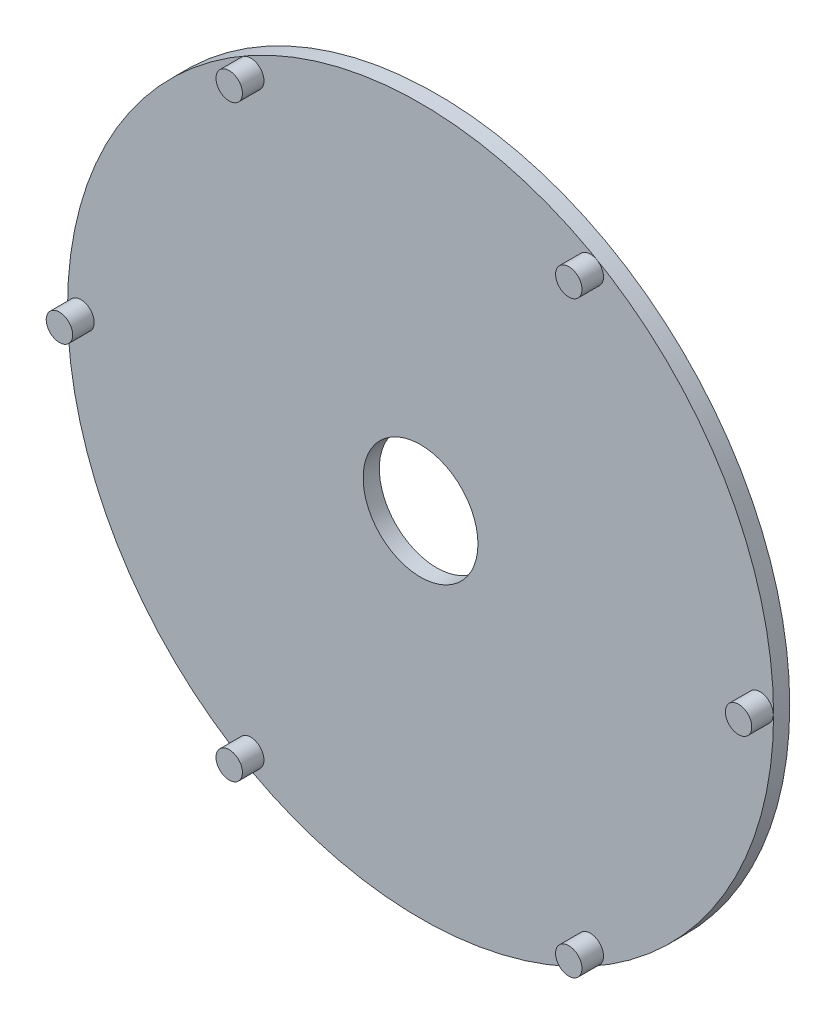
ISO-10303-21;
HEADER;
FILE_DESCRIPTION(('STEP AP214'),'2;1');
FILE_NAME('part.step','',(''),(''),'','','');
FILE_SCHEMA(('AUTOMOTIVE_DESIGN { 1 0 10303 214 1 1 1 1 }'));
ENDSEC;
DATA;
#1=APPLICATION_CONTEXT('core data for automotive mechanical design processes');
#2=APPLICATION_PROTOCOL_DEFINITION('international standard','automotive_design',2000,#1);
#3=PRODUCT_CONTEXT('',#1,'mechanical');
#4=PRODUCT('Part','Part','',(#3));
#5=PRODUCT_RELATED_PRODUCT_CATEGORY('part','',(#4));
#6=PRODUCT_DEFINITION_FORMATION('','',#4);
#7=PRODUCT_DEFINITION_CONTEXT('part definition',#1,'design');
#8=PRODUCT_DEFINITION('design','',#6,#7);
#9=PRODUCT_DEFINITION_SHAPE('','',#8);
#10=(LENGTH_UNIT() NAMED_UNIT(*) SI_UNIT(.MILLI.,.METRE.));
#11=(NAMED_UNIT(*) PLANE_ANGLE_UNIT() SI_UNIT($,.RADIAN.));
#12=(NAMED_UNIT(*) SI_UNIT($,.STERADIAN.) SOLID_ANGLE_UNIT());
#13=UNCERTAINTY_MEASURE_WITH_UNIT(LENGTH_MEASURE(1.E-05),#10,'distance_accuracy_value','');
#14=(GEOMETRIC_REPRESENTATION_CONTEXT(3) GLOBAL_UNCERTAINTY_ASSIGNED_CONTEXT((#13)) GLOBAL_UNIT_ASSIGNED_CONTEXT((#10,
#11,#12)) REPRESENTATION_CONTEXT('',''));
#15=CARTESIAN_POINT('',(0.,0.,0.));
#16=DIRECTION('',(0.,0.,1.));
#17=DIRECTION('',(1.,0.,0.));
#18=AXIS2_PLACEMENT_3D('',#15,#16,#17);
#19=CARTESIAN_POINT('',(0.,0.,-3.));
#20=DIRECTION('',(0.,0.,1.));
#21=DIRECTION('',(1.,0.,0.));
#22=AXIS2_PLACEMENT_3D('',#19,#20,#21);
#23=CYLINDRICAL_SURFACE('',#22,65.5);
#24=CARTESIAN_POINT('',(0.,0.,-3.));
#25=DIRECTION('',(0.,0.,1.));
#26=DIRECTION('',(1.,0.,0.));
#27=AXIS2_PLACEMENT_3D('',#24,#25,#26);
#28=CIRCLE('',#27,65.5);
#29=CARTESIAN_POINT('',(65.5,0.,-3.));
#30=VERTEX_POINT('',#29);
#31=EDGE_CURVE('E10',#30,#30,#28,.T.);
#32=ORIENTED_EDGE('',*,*,#31,.T.);
#33=EDGE_LOOP('',(#32));
#34=FACE_BOUND('',#33,.T.);
#35=CARTESIAN_POINT('',(0.,0.,0.));
#36=DIRECTION('',(0.,0.,1.));
#37=DIRECTION('',(1.,0.,0.));
#38=AXIS2_PLACEMENT_3D('',#35,#36,#37);
#39=CIRCLE('',#38,65.5);
#40=CARTESIAN_POINT('',(65.5,0.,0.));
#41=VERTEX_POINT('',#40);
#42=EDGE_CURVE('E44',#41,#41,#39,.T.);
#43=ORIENTED_EDGE('',*,*,#42,.F.);
#44=EDGE_LOOP('',(#43));
#45=FACE_BOUND('',#44,.T.);
#46=ADVANCED_FACE('F41',(#34,#45),#23,.T.);
#47=CARTESIAN_POINT('',(0.,0.,-3.));
#48=DIRECTION('',(0.,0.,1.));
#49=DIRECTION('',(1.,0.,0.));
#50=AXIS2_PLACEMENT_3D('',#47,#48,#49);
#51=PLANE('',#50);
#52=CARTESIAN_POINT('',(0.,0.,-3.));
#53=DIRECTION('',(0.,0.,1.));
#54=DIRECTION('',(1.,0.,0.));
#55=AXIS2_PLACEMENT_3D('',#52,#53,#54);
#56=CIRCLE('',#55,10.65);
#57=CARTESIAN_POINT('',(10.65,0.,-3.));
#58=VERTEX_POINT('',#57);
#59=EDGE_CURVE('E86',#58,#58,#56,.T.);
#60=ORIENTED_EDGE('',*,*,#59,.T.);
#61=EDGE_LOOP('',(#60));
#62=FACE_BOUND('',#61,.T.);
#63=ORIENTED_EDGE('',*,*,#31,.F.);
#64=EDGE_LOOP('',(#63));
#65=FACE_BOUND('',#64,.T.);
#66=ADVANCED_FACE('F95',(#62,#65),#51,.F.);
#67=CARTESIAN_POINT('',(0.,0.,0.));
#68=DIRECTION('',(0.,0.,1.));
#69=DIRECTION('',(1.,0.,0.));
#70=AXIS2_PLACEMENT_3D('',#67,#68,#69);
#71=PLANE('',#70);
#72=CARTESIAN_POINT('',(0.,0.,0.));
#73=DIRECTION('',(0.,0.,1.));
#74=DIRECTION('',(1.,0.,0.));
#75=AXIS2_PLACEMENT_3D('',#72,#73,#74);
#76=CIRCLE('',#75,10.65);
#77=CARTESIAN_POINT('',(10.65,0.,0.));
#78=VERTEX_POINT('',#77);
#79=EDGE_CURVE('E89',#78,#78,#76,.T.);
#80=ORIENTED_EDGE('',*,*,#79,.F.);
#81=EDGE_LOOP('',(#80));
#82=FACE_BOUND('',#81,.T.);
#83=CARTESIAN_POINT('',(-31.5,-54.5596004384197,0.));
#84=DIRECTION('',(0.,0.,1.));
#85=DIRECTION('',(1.,0.,0.));
#86=AXIS2_PLACEMENT_3D('',#83,#84,#85);
#87=CIRCLE('',#86,2.45);
#88=CARTESIAN_POINT('',(-29.05,-54.5596004384197,0.));
#89=VERTEX_POINT('',#88);
#90=EDGE_CURVE('E80',#89,#89,#87,.T.);
#91=ORIENTED_EDGE('',*,*,#90,.F.);
#92=EDGE_LOOP('',(#91));
#93=FACE_BOUND('',#92,.T.);
#94=CARTESIAN_POINT('',(31.5,-54.5596004384196,0.));
#95=DIRECTION('',(0.,0.,1.));
#96=DIRECTION('',(1.,0.,0.));
#97=AXIS2_PLACEMENT_3D('',#94,#95,#96);
#98=CIRCLE('',#97,2.45);
#99=CARTESIAN_POINT('',(33.95,-54.5596004384196,0.));
#100=VERTEX_POINT('',#99);
#101=EDGE_CURVE('E74',#100,#100,#98,.T.);
#102=ORIENTED_EDGE('',*,*,#101,.F.);
#103=EDGE_LOOP('',(#102));
#104=FACE_BOUND('',#103,.T.);
#105=CARTESIAN_POINT('',(63.,0.,0.));
#106=DIRECTION('',(0.,0.,1.));
#107=DIRECTION('',(1.,0.,0.));
#108=AXIS2_PLACEMENT_3D('',#105,#106,#107);
#109=CIRCLE('',#108,2.45);
#110=CARTESIAN_POINT('',(65.45,0.,0.));
#111=VERTEX_POINT('',#110);
#112=EDGE_CURVE('E68',#111,#111,#109,.T.);
#113=ORIENTED_EDGE('',*,*,#112,.F.);
#114=EDGE_LOOP('',(#113));
#115=FACE_BOUND('',#114,.T.);
#116=CARTESIAN_POINT('',(-31.5,54.5596004384196,0.));
#117=DIRECTION('',(0.,0.,1.));
#118=DIRECTION('',(1.,0.,0.));
#119=AXIS2_PLACEMENT_3D('',#116,#117,#118);
#120=CIRCLE('',#119,2.45);
#121=CARTESIAN_POINT('',(-29.05,54.5596004384196,0.));
#122=VERTEX_POINT('',#121);
#123=EDGE_CURVE('E62',#122,#122,#120,.T.);
#124=ORIENTED_EDGE('',*,*,#123,.F.);
#125=EDGE_LOOP('',(#124));
#126=FACE_BOUND('',#125,.T.);
#127=CARTESIAN_POINT('',(31.5,54.5596004384197,0.));
#128=DIRECTION('',(0.,0.,1.));
#129=DIRECTION('',(1.,0.,0.));
#130=AXIS2_PLACEMENT_3D('',#127,#128,#129);
#131=CIRCLE('',#130,2.45);
#132=CARTESIAN_POINT('',(33.95,54.5596004384197,0.));
#133=VERTEX_POINT('',#132);
#134=EDGE_CURVE('E56',#133,#133,#131,.T.);
#135=ORIENTED_EDGE('',*,*,#134,.F.);
#136=EDGE_LOOP('',(#135));
#137=FACE_BOUND('',#136,.T.);
#138=CARTESIAN_POINT('',(-63.,0.,0.));
#139=DIRECTION('',(0.,0.,1.));
#140=DIRECTION('',(1.,0.,0.));
#141=AXIS2_PLACEMENT_3D('',#138,#139,#140);
#142=CIRCLE('',#141,2.45);
#143=CARTESIAN_POINT('',(-60.55,0.,0.));
#144=VERTEX_POINT('',#143);
#145=EDGE_CURVE('E53',#144,#144,#142,.T.);
#146=ORIENTED_EDGE('',*,*,#145,.F.);
#147=EDGE_LOOP('',(#146));
#148=FACE_BOUND('',#147,.T.);
#149=ORIENTED_EDGE('',*,*,#42,.T.);
#150=EDGE_LOOP('',(#149));
#151=FACE_BOUND('',#150,.T.);
#152=ADVANCED_FACE('F105',(#82,#93,#104,#115,#126,#137,#148,#151),#71,.T.);
#153=CARTESIAN_POINT('',(-63.,0.,3.99999999999999));
#154=DIRECTION('',(0.,0.,-1.));
#155=DIRECTION('',(-1.,0.,0.));
#156=AXIS2_PLACEMENT_3D('',#153,#154,#155);
#157=CYLINDRICAL_SURFACE('',#156,2.45);
#158=CARTESIAN_POINT('',(-63.,0.,3.99999999999999));
#159=DIRECTION('',(0.,0.,1.));
#160=DIRECTION('',(1.,0.,0.));
#161=AXIS2_PLACEMENT_3D('',#158,#159,#160);
#162=CIRCLE('',#161,2.45);
#163=CARTESIAN_POINT('',(-60.55,0.,3.99999999999999));
#164=VERTEX_POINT('',#163);
#165=EDGE_CURVE('E51',#164,#164,#162,.T.);
#166=ORIENTED_EDGE('',*,*,#165,.F.);
#167=EDGE_LOOP('',(#166));
#168=FACE_BOUND('',#167,.T.);
#169=ORIENTED_EDGE('',*,*,#145,.T.);
#170=EDGE_LOOP('',(#169));
#171=FACE_BOUND('',#170,.T.);
#172=ADVANCED_FACE('F108',(#168,#171),#157,.T.);
#173=CARTESIAN_POINT('',(0.,0.,3.99999999999999));
#174=DIRECTION('',(0.,0.,1.));
#175=DIRECTION('',(1.,0.,0.));
#176=AXIS2_PLACEMENT_3D('',#173,#174,#175);
#177=PLANE('',#176);
#178=ORIENTED_EDGE('',*,*,#165,.T.);
#179=EDGE_LOOP('',(#178));
#180=FACE_BOUND('',#179,.T.);
#181=ADVANCED_FACE('F134',(#180),#177,.T.);
#182=CARTESIAN_POINT('',(31.5,54.5596004384197,3.99999999999999));
#183=DIRECTION('',(0.,0.,-1.));
#184=DIRECTION('',(-1.,0.,0.));
#185=AXIS2_PLACEMENT_3D('',#182,#183,#184);
#186=CYLINDRICAL_SURFACE('',#185,2.45);
#187=CARTESIAN_POINT('',(31.5,54.5596004384197,3.99999999999999));
#188=DIRECTION('',(0.,0.,1.));
#189=DIRECTION('',(1.,0.,0.));
#190=AXIS2_PLACEMENT_3D('',#187,#188,#189);
#191=CIRCLE('',#190,2.45);
#192=CARTESIAN_POINT('',(33.95,54.5596004384197,3.99999999999999));
#193=VERTEX_POINT('',#192);
#194=EDGE_CURVE('E59',#193,#193,#191,.T.);
#195=ORIENTED_EDGE('',*,*,#194,.F.);
#196=EDGE_LOOP('',(#195));
#197=FACE_BOUND('',#196,.T.);
#198=ORIENTED_EDGE('',*,*,#134,.T.);
#199=EDGE_LOOP('',(#198));
#200=FACE_BOUND('',#199,.T.);
#201=ADVANCED_FACE('F138',(#197,#200),#186,.T.);
#202=CARTESIAN_POINT('',(0.,0.,3.99999999999999));
#203=DIRECTION('',(0.,0.,1.));
#204=DIRECTION('',(1.,0.,0.));
#205=AXIS2_PLACEMENT_3D('',#202,#203,#204);
#206=PLANE('',#205);
#207=ORIENTED_EDGE('',*,*,#194,.T.);
#208=EDGE_LOOP('',(#207));
#209=FACE_BOUND('',#208,.T.);
#210=ADVANCED_FACE('F140',(#209),#206,.T.);
#211=CARTESIAN_POINT('',(-31.5,54.5596004384196,3.99999999999999));
#212=DIRECTION('',(0.,0.,-1.));
#213=DIRECTION('',(-1.,0.,0.));
#214=AXIS2_PLACEMENT_3D('',#211,#212,#213);
#215=CYLINDRICAL_SURFACE('',#214,2.45);
#216=CARTESIAN_POINT('',(-31.5,54.5596004384196,3.99999999999999));
#217=DIRECTION('',(0.,0.,1.));
#218=DIRECTION('',(1.,0.,0.));
#219=AXIS2_PLACEMENT_3D('',#216,#217,#218);
#220=CIRCLE('',#219,2.45);
#221=CARTESIAN_POINT('',(-29.05,54.5596004384196,3.99999999999999));
#222=VERTEX_POINT('',#221);
#223=EDGE_CURVE('E65',#222,#222,#220,.T.);
#224=ORIENTED_EDGE('',*,*,#223,.F.);
#225=EDGE_LOOP('',(#224));
#226=FACE_BOUND('',#225,.T.);
#227=ORIENTED_EDGE('',*,*,#123,.T.);
#228=EDGE_LOOP('',(#227));
#229=FACE_BOUND('',#228,.T.);
#230=ADVANCED_FACE('F143',(#226,#229),#215,.T.);
#231=CARTESIAN_POINT('',(-31.5,54.5596004384196,3.99999999999999));
#232=DIRECTION('',(0.,0.,1.));
#233=DIRECTION('',(1.,0.,0.));
#234=AXIS2_PLACEMENT_3D('',#231,#232,#233);
#235=PLANE('',#234);
#236=ORIENTED_EDGE('',*,*,#223,.T.);
#237=EDGE_LOOP('',(#236));
#238=FACE_BOUND('',#237,.T.);
#239=ADVANCED_FACE('F148',(#238),#235,.T.);
#240=CARTESIAN_POINT('',(63.,0.,3.99999999999999));
#241=DIRECTION('',(0.,0.,-1.));
#242=DIRECTION('',(-1.,0.,0.));
#243=AXIS2_PLACEMENT_3D('',#240,#241,#242);
#244=CYLINDRICAL_SURFACE('',#243,2.45);
#245=CARTESIAN_POINT('',(63.,0.,3.99999999999999));
#246=DIRECTION('',(0.,0.,1.));
#247=DIRECTION('',(1.,0.,0.));
#248=AXIS2_PLACEMENT_3D('',#245,#246,#247);
#249=CIRCLE('',#248,2.45);
#250=CARTESIAN_POINT('',(65.45,0.,3.99999999999999));
#251=VERTEX_POINT('',#250);
#252=EDGE_CURVE('E71',#251,#251,#249,.T.);
#253=ORIENTED_EDGE('',*,*,#252,.F.);
#254=EDGE_LOOP('',(#253));
#255=FACE_BOUND('',#254,.T.);
#256=ORIENTED_EDGE('',*,*,#112,.T.);
#257=EDGE_LOOP('',(#256));
#258=FACE_BOUND('',#257,.T.);
#259=ADVANCED_FACE('F151',(#255,#258),#244,.T.);
#260=CARTESIAN_POINT('',(63.,0.,3.99999999999999));
#261=DIRECTION('',(0.,0.,1.));
#262=DIRECTION('',(1.,0.,0.));
#263=AXIS2_PLACEMENT_3D('',#260,#261,#262);
#264=PLANE('',#263);
#265=ORIENTED_EDGE('',*,*,#252,.T.);
#266=EDGE_LOOP('',(#265));
#267=FACE_BOUND('',#266,.T.);
#268=ADVANCED_FACE('F156',(#267),#264,.T.);
#269=CARTESIAN_POINT('',(31.5,-54.5596004384196,3.99999999999999));
#270=DIRECTION('',(0.,0.,-1.));
#271=DIRECTION('',(-1.,0.,0.));
#272=AXIS2_PLACEMENT_3D('',#269,#270,#271);
#273=CYLINDRICAL_SURFACE('',#272,2.45);
#274=CARTESIAN_POINT('',(31.5,-54.5596004384196,3.99999999999999));
#275=DIRECTION('',(0.,0.,1.));
#276=DIRECTION('',(1.,0.,0.));
#277=AXIS2_PLACEMENT_3D('',#274,#275,#276);
#278=CIRCLE('',#277,2.45);
#279=CARTESIAN_POINT('',(33.95,-54.5596004384196,3.99999999999999));
#280=VERTEX_POINT('',#279);
#281=EDGE_CURVE('E77',#280,#280,#278,.T.);
#282=ORIENTED_EDGE('',*,*,#281,.F.);
#283=EDGE_LOOP('',(#282));
#284=FACE_BOUND('',#283,.T.);
#285=ORIENTED_EDGE('',*,*,#101,.T.);
#286=EDGE_LOOP('',(#285));
#287=FACE_BOUND('',#286,.T.);
#288=ADVANCED_FACE('F159',(#284,#287),#273,.T.);
#289=CARTESIAN_POINT('',(31.5,-54.5596004384196,3.99999999999999));
#290=DIRECTION('',(0.,0.,1.));
#291=DIRECTION('',(1.,0.,0.));
#292=AXIS2_PLACEMENT_3D('',#289,#290,#291);
#293=PLANE('',#292);
#294=ORIENTED_EDGE('',*,*,#281,.T.);
#295=EDGE_LOOP('',(#294));
#296=FACE_BOUND('',#295,.T.);
#297=ADVANCED_FACE('F164',(#296),#293,.T.);
#298=CARTESIAN_POINT('',(-31.5,-54.5596004384197,3.99999999999999));
#299=DIRECTION('',(0.,0.,-1.));
#300=DIRECTION('',(-1.,0.,0.));
#301=AXIS2_PLACEMENT_3D('',#298,#299,#300);
#302=CYLINDRICAL_SURFACE('',#301,2.45);
#303=CARTESIAN_POINT('',(-31.5,-54.5596004384197,3.99999999999999));
#304=DIRECTION('',(0.,0.,1.));
#305=DIRECTION('',(1.,0.,0.));
#306=AXIS2_PLACEMENT_3D('',#303,#304,#305);
#307=CIRCLE('',#306,2.45);
#308=CARTESIAN_POINT('',(-29.05,-54.5596004384197,3.99999999999999));
#309=VERTEX_POINT('',#308);
#310=EDGE_CURVE('E83',#309,#309,#307,.T.);
#311=ORIENTED_EDGE('',*,*,#310,.F.);
#312=EDGE_LOOP('',(#311));
#313=FACE_BOUND('',#312,.T.);
#314=ORIENTED_EDGE('',*,*,#90,.T.);
#315=EDGE_LOOP('',(#314));
#316=FACE_BOUND('',#315,.T.);
#317=ADVANCED_FACE('F167',(#313,#316),#302,.T.);
#318=CARTESIAN_POINT('',(-31.5,-54.5596004384197,3.99999999999999));
#319=DIRECTION('',(0.,0.,1.));
#320=DIRECTION('',(1.,0.,0.));
#321=AXIS2_PLACEMENT_3D('',#318,#319,#320);
#322=PLANE('',#321);
#323=ORIENTED_EDGE('',*,*,#310,.T.);
#324=EDGE_LOOP('',(#323));
#325=FACE_BOUND('',#324,.T.);
#326=ADVANCED_FACE('F101',(#325),#322,.T.);
#327=CARTESIAN_POINT('',(0.,0.,-3.));
#328=DIRECTION('',(0.,0.,1.));
#329=DIRECTION('',(1.,0.,0.));
#330=AXIS2_PLACEMENT_3D('',#327,#328,#329);
#331=CYLINDRICAL_SURFACE('',#330,10.65);
#332=ORIENTED_EDGE('',*,*,#59,.F.);
#333=EDGE_LOOP('',(#332));
#334=FACE_BOUND('',#333,.T.);
#335=ORIENTED_EDGE('',*,*,#79,.T.);
#336=EDGE_LOOP('',(#335));
#337=FACE_BOUND('',#336,.T.);
#338=ADVANCED_FACE('F98',(#334,#337),#331,.F.);
#339=CLOSED_SHELL('',(#46,#66,#152,#172,#181,#201,#210,#230,#239,#259,#268,#288,#297,#317,#326,#338));
#340=MANIFOLD_SOLID_BREP('B2',#339);
#341=ADVANCED_BREP_SHAPE_REPRESENTATION('',(#18,#340),#14);
#342=SHAPE_DEFINITION_REPRESENTATION(#9,#341);
ENDSEC;
END-ISO-10303-21;
